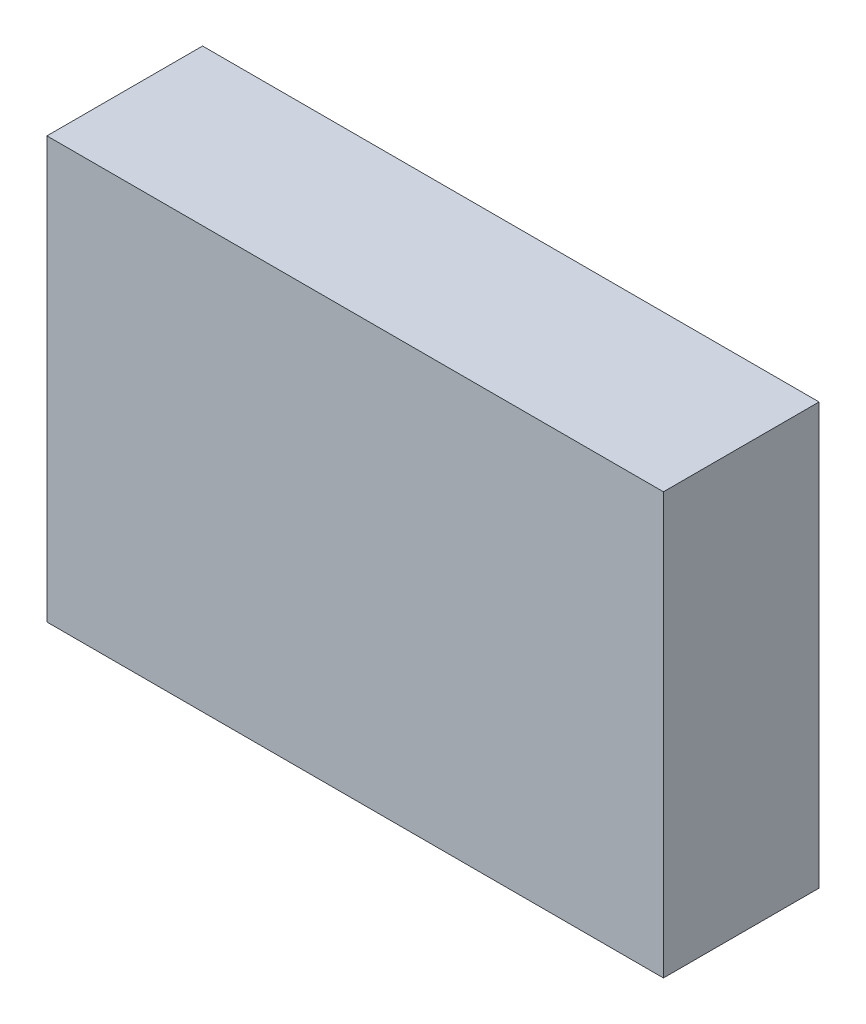
ISO-10303-21;
HEADER;
FILE_DESCRIPTION(('STEP AP214'),'2;1');
FILE_NAME('part.step','',(''),(''),'','','');
FILE_SCHEMA(('AUTOMOTIVE_DESIGN { 1 0 10303 214 1 1 1 1 }'));
ENDSEC;
DATA;
#1=APPLICATION_CONTEXT('core data for automotive mechanical design processes');
#2=APPLICATION_PROTOCOL_DEFINITION('international standard','automotive_design',2000,#1);
#3=PRODUCT_CONTEXT('',#1,'mechanical');
#4=PRODUCT('Part','Part','',(#3));
#5=PRODUCT_RELATED_PRODUCT_CATEGORY('part','',(#4));
#6=PRODUCT_DEFINITION_FORMATION('','',#4);
#7=PRODUCT_DEFINITION_CONTEXT('part definition',#1,'design');
#8=PRODUCT_DEFINITION('design','',#6,#7);
#9=PRODUCT_DEFINITION_SHAPE('','',#8);
#10=(LENGTH_UNIT() NAMED_UNIT(*) SI_UNIT(.MILLI.,.METRE.));
#11=(NAMED_UNIT(*) PLANE_ANGLE_UNIT() SI_UNIT($,.RADIAN.));
#12=(NAMED_UNIT(*) SI_UNIT($,.STERADIAN.) SOLID_ANGLE_UNIT());
#13=UNCERTAINTY_MEASURE_WITH_UNIT(LENGTH_MEASURE(1.E-05),#10,'distance_accuracy_value','');
#14=(GEOMETRIC_REPRESENTATION_CONTEXT(3) GLOBAL_UNCERTAINTY_ASSIGNED_CONTEXT((#13)) GLOBAL_UNIT_ASSIGNED_CONTEXT((#10,
#11,#12)) REPRESENTATION_CONTEXT('',''));
#15=CARTESIAN_POINT('',(0.,0.,0.));
#16=DIRECTION('',(0.,0.,1.));
#17=DIRECTION('',(1.,0.,0.));
#18=AXIS2_PLACEMENT_3D('',#15,#16,#17);
#19=CARTESIAN_POINT('',(0.,0.,52.));
#20=DIRECTION('',(-1.,0.,0.));
#21=DIRECTION('',(0.,0.,1.));
#22=AXIS2_PLACEMENT_3D('',#19,#20,#21);
#23=PLANE('',#22);
#24=DIRECTION('',(0.,1.,0.));
#25=VECTOR('',#24,1.);
#26=CARTESIAN_POINT('',(0.,0.,0.));
#27=LINE('',#26,#25);
#28=CARTESIAN_POINT('',(0.,0.,0.));
#29=VERTEX_POINT('',#28);
#30=CARTESIAN_POINT('',(0.,140.7,0.));
#31=VERTEX_POINT('',#30);
#32=EDGE_CURVE('E100',#29,#31,#27,.T.);
#33=ORIENTED_EDGE('',*,*,#32,.T.);
#34=DIRECTION('',(0.,0.,-1.));
#35=VECTOR('',#34,1.);
#36=CARTESIAN_POINT('',(0.,140.7,52.));
#37=LINE('',#36,#35);
#38=CARTESIAN_POINT('',(0.,140.7,52.));
#39=VERTEX_POINT('',#38);
#40=EDGE_CURVE('E11',#39,#31,#37,.T.);
#41=ORIENTED_EDGE('',*,*,#40,.F.);
#42=DIRECTION('',(0.,1.,0.));
#43=VECTOR('',#42,1.);
#44=CARTESIAN_POINT('',(0.,0.,52.));
#45=LINE('',#44,#43);
#46=CARTESIAN_POINT('',(0.,0.,52.));
#47=VERTEX_POINT('',#46);
#48=EDGE_CURVE('E88',#47,#39,#45,.T.);
#49=ORIENTED_EDGE('',*,*,#48,.F.);
#50=DIRECTION('',(0.,0.,-1.));
#51=VECTOR('',#50,1.);
#52=CARTESIAN_POINT('',(0.,0.,52.));
#53=LINE('',#52,#51);
#54=EDGE_CURVE('E96',#47,#29,#53,.T.);
#55=ORIENTED_EDGE('',*,*,#54,.T.);
#56=EDGE_LOOP('',(#33,#41,#49,#55));
#57=FACE_BOUND('',#56,.T.);
#58=ADVANCED_FACE('F37',(#57),#23,.F.);
#59=CARTESIAN_POINT('',(0.,140.7,52.));
#60=DIRECTION('',(0.,-1.,0.));
#61=DIRECTION('',(1.,0.,0.));
#62=AXIS2_PLACEMENT_3D('',#59,#60,#61);
#63=PLANE('',#62);
#64=DIRECTION('',(-1.,0.,0.));
#65=VECTOR('',#64,1.);
#66=CARTESIAN_POINT('',(0.,140.7,0.));
#67=LINE('',#66,#65);
#68=CARTESIAN_POINT('',(-206.,140.7,0.));
#69=VERTEX_POINT('',#68);
#70=EDGE_CURVE('E92',#31,#69,#67,.T.);
#71=ORIENTED_EDGE('',*,*,#70,.T.);
#72=DIRECTION('',(0.,0.,-1.));
#73=VECTOR('',#72,1.);
#74=CARTESIAN_POINT('',(-206.,140.7,52.));
#75=LINE('',#74,#73);
#76=CARTESIAN_POINT('',(-206.,140.7,52.));
#77=VERTEX_POINT('',#76);
#78=EDGE_CURVE('E45',#77,#69,#75,.T.);
#79=ORIENTED_EDGE('',*,*,#78,.F.);
#80=DIRECTION('',(-1.,0.,0.));
#81=VECTOR('',#80,1.);
#82=CARTESIAN_POINT('',(0.,140.7,52.));
#83=LINE('',#82,#81);
#84=EDGE_CURVE('E83',#39,#77,#83,.T.);
#85=ORIENTED_EDGE('',*,*,#84,.F.);
#86=ORIENTED_EDGE('',*,*,#40,.T.);
#87=EDGE_LOOP('',(#71,#79,#85,#86));
#88=FACE_BOUND('',#87,.T.);
#89=ADVANCED_FACE('F91',(#88),#63,.F.);
#90=CARTESIAN_POINT('',(-206.,0.,52.));
#91=DIRECTION('',(1.,0.,0.));
#92=DIRECTION('',(0.,0.,-1.));
#93=AXIS2_PLACEMENT_3D('',#90,#91,#92);
#94=PLANE('',#93);
#95=DIRECTION('',(0.,-1.,0.));
#96=VECTOR('',#95,1.);
#97=CARTESIAN_POINT('',(-206.,0.,0.));
#98=LINE('',#97,#96);
#99=CARTESIAN_POINT('',(-206.,0.,0.));
#100=VERTEX_POINT('',#99);
#101=EDGE_CURVE('E70',#69,#100,#98,.T.);
#102=ORIENTED_EDGE('',*,*,#101,.T.);
#103=DIRECTION('',(0.,0.,-1.));
#104=VECTOR('',#103,1.);
#105=CARTESIAN_POINT('',(-206.,0.,52.));
#106=LINE('',#105,#104);
#107=CARTESIAN_POINT('',(-206.,0.,52.));
#108=VERTEX_POINT('',#107);
#109=EDGE_CURVE('E93',#108,#100,#106,.T.);
#110=ORIENTED_EDGE('',*,*,#109,.F.);
#111=DIRECTION('',(0.,-1.,0.));
#112=VECTOR('',#111,1.);
#113=CARTESIAN_POINT('',(-206.,0.,52.));
#114=LINE('',#113,#112);
#115=EDGE_CURVE('E86',#77,#108,#114,.T.);
#116=ORIENTED_EDGE('',*,*,#115,.F.);
#117=ORIENTED_EDGE('',*,*,#78,.T.);
#118=EDGE_LOOP('',(#102,#110,#116,#117));
#119=FACE_BOUND('',#118,.T.);
#120=ADVANCED_FACE('F94',(#119),#94,.F.);
#121=CARTESIAN_POINT('',(0.,0.,52.));
#122=DIRECTION('',(0.,1.,0.));
#123=DIRECTION('',(0.,0.,1.));
#124=AXIS2_PLACEMENT_3D('',#121,#122,#123);
#125=PLANE('',#124);
#126=DIRECTION('',(1.,0.,0.));
#127=VECTOR('',#126,1.);
#128=CARTESIAN_POINT('',(0.,0.,0.));
#129=LINE('',#128,#127);
#130=EDGE_CURVE('E76',#100,#29,#129,.T.);
#131=ORIENTED_EDGE('',*,*,#130,.T.);
#132=ORIENTED_EDGE('',*,*,#54,.F.);
#133=DIRECTION('',(1.,0.,0.));
#134=VECTOR('',#133,1.);
#135=CARTESIAN_POINT('',(0.,0.,52.));
#136=LINE('',#135,#134);
#137=EDGE_CURVE('E53',#108,#47,#136,.T.);
#138=ORIENTED_EDGE('',*,*,#137,.F.);
#139=ORIENTED_EDGE('',*,*,#109,.T.);
#140=EDGE_LOOP('',(#131,#132,#138,#139));
#141=FACE_BOUND('',#140,.T.);
#142=ADVANCED_FACE('F107',(#141),#125,.F.);
#143=CARTESIAN_POINT('',(0.,0.,52.));
#144=DIRECTION('',(0.,0.,1.));
#145=DIRECTION('',(1.,0.,0.));
#146=AXIS2_PLACEMENT_3D('',#143,#144,#145);
#147=PLANE('',#146);
#148=ORIENTED_EDGE('',*,*,#48,.T.);
#149=ORIENTED_EDGE('',*,*,#84,.T.);
#150=ORIENTED_EDGE('',*,*,#115,.T.);
#151=ORIENTED_EDGE('',*,*,#137,.T.);
#152=EDGE_LOOP('',(#148,#149,#150,#151));
#153=FACE_BOUND('',#152,.T.);
#154=ADVANCED_FACE('F84',(#153),#147,.T.);
#155=CARTESIAN_POINT('',(0.,0.,0.));
#156=DIRECTION('',(0.,0.,1.));
#157=DIRECTION('',(1.,0.,0.));
#158=AXIS2_PLACEMENT_3D('',#155,#156,#157);
#159=PLANE('',#158);
#160=ORIENTED_EDGE('',*,*,#32,.F.);
#161=ORIENTED_EDGE('',*,*,#130,.F.);
#162=ORIENTED_EDGE('',*,*,#101,.F.);
#163=ORIENTED_EDGE('',*,*,#70,.F.);
#164=EDGE_LOOP('',(#160,#161,#162,#163));
#165=FACE_BOUND('',#164,.T.);
#166=ADVANCED_FACE('F110',(#165),#159,.F.);
#167=CLOSED_SHELL('',(#58,#89,#120,#142,#154,#166));
#168=MANIFOLD_SOLID_BREP('B2',#167);
#169=ADVANCED_BREP_SHAPE_REPRESENTATION('',(#18,#168),#14);
#170=SHAPE_DEFINITION_REPRESENTATION(#9,#169);
ENDSEC;
END-ISO-10303-21;
